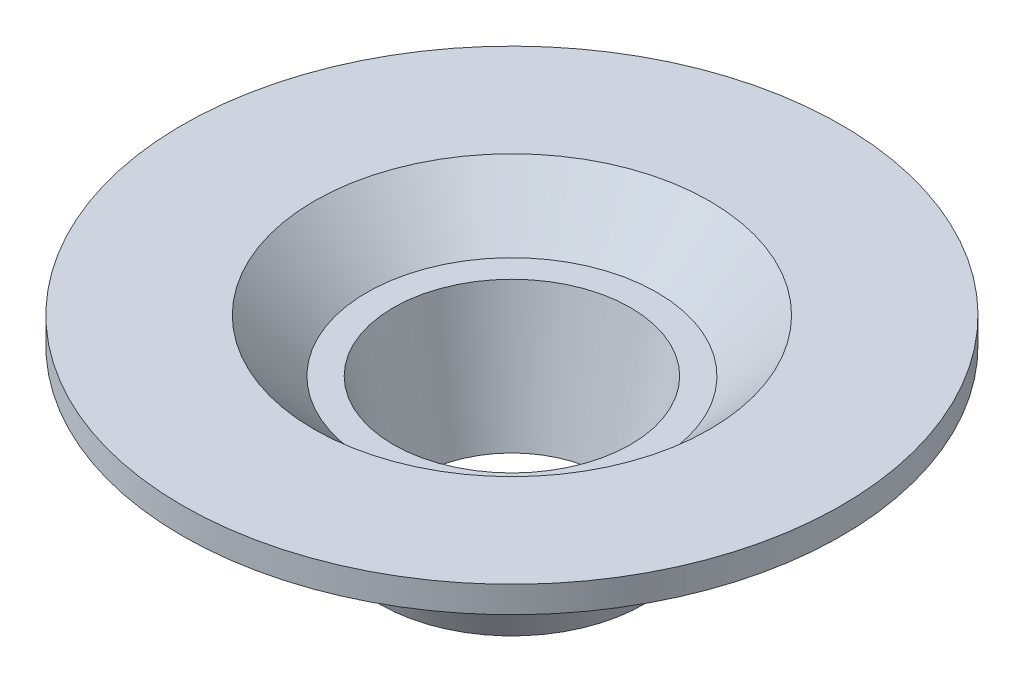
ISO-10303-21;
HEADER;
FILE_DESCRIPTION(('STEP AP214'),'2;1');
FILE_NAME('part.step','',(''),(''),'','','');
FILE_SCHEMA(('AUTOMOTIVE_DESIGN { 1 0 10303 214 1 1 1 1 }'));
ENDSEC;
DATA;
#1=APPLICATION_CONTEXT('core data for automotive mechanical design processes');
#2=APPLICATION_PROTOCOL_DEFINITION('international standard','automotive_design',2000,#1);
#3=PRODUCT_CONTEXT('',#1,'mechanical');
#4=PRODUCT('Part','Part','',(#3));
#5=PRODUCT_RELATED_PRODUCT_CATEGORY('part','',(#4));
#6=PRODUCT_DEFINITION_FORMATION('','',#4);
#7=PRODUCT_DEFINITION_CONTEXT('part definition',#1,'design');
#8=PRODUCT_DEFINITION('design','',#6,#7);
#9=PRODUCT_DEFINITION_SHAPE('','',#8);
#10=(LENGTH_UNIT() NAMED_UNIT(*) SI_UNIT(.MILLI.,.METRE.));
#11=(NAMED_UNIT(*) PLANE_ANGLE_UNIT() SI_UNIT($,.RADIAN.));
#12=(NAMED_UNIT(*) SI_UNIT($,.STERADIAN.) SOLID_ANGLE_UNIT());
#13=UNCERTAINTY_MEASURE_WITH_UNIT(LENGTH_MEASURE(1.E-05),#10,'distance_accuracy_value','');
#14=(GEOMETRIC_REPRESENTATION_CONTEXT(3) GLOBAL_UNCERTAINTY_ASSIGNED_CONTEXT((#13)) GLOBAL_UNIT_ASSIGNED_CONTEXT((#10,
#11,#12)) REPRESENTATION_CONTEXT('',''));
#15=CARTESIAN_POINT('',(0.,0.,0.));
#16=DIRECTION('',(0.,0.,1.));
#17=DIRECTION('',(1.,0.,0.));
#18=AXIS2_PLACEMENT_3D('',#15,#16,#17);
#19=CARTESIAN_POINT('',(0.,-5.,-5.));
#20=DIRECTION('',(0.,1.,0.));
#21=DIRECTION('',(0.,0.,1.));
#22=AXIS2_PLACEMENT_3D('',#19,#20,#21);
#23=PLANE('',#22);
#24=CARTESIAN_POINT('',(0.,-5.,0.));
#25=DIRECTION('',(0.,1.,0.));
#26=DIRECTION('',(0.,0.,1.));
#27=AXIS2_PLACEMENT_3D('',#24,#25,#26);
#28=CIRCLE('',#27,5.);
#29=CARTESIAN_POINT('',(0.,-5.,5.));
#30=VERTEX_POINT('',#29);
#31=EDGE_CURVE('E10',#30,#30,#28,.T.);
#32=ORIENTED_EDGE('',*,*,#31,.F.);
#33=EDGE_LOOP('',(#32));
#34=FACE_BOUND('',#33,.T.);
#35=CARTESIAN_POINT('',(0.,-5.,0.));
#36=DIRECTION('',(0.,1.,0.));
#37=DIRECTION('',(0.,0.,1.));
#38=AXIS2_PLACEMENT_3D('',#35,#36,#37);
#39=CIRCLE('',#38,3.5);
#40=CARTESIAN_POINT('',(0.,-5.,3.5));
#41=VERTEX_POINT('',#40);
#42=EDGE_CURVE('E71',#41,#41,#39,.T.);
#43=ORIENTED_EDGE('',*,*,#42,.T.);
#44=EDGE_LOOP('',(#43));
#45=FACE_BOUND('',#44,.T.);
#46=ADVANCED_FACE('F37',(#34,#45),#23,.F.);
#47=CARTESIAN_POINT('',(0.,-5.,0.));
#48=DIRECTION('',(0.,1.,0.));
#49=DIRECTION('',(0.,0.,1.));
#50=AXIS2_PLACEMENT_3D('',#47,#48,#49);
#51=CONICAL_SURFACE('',#50,5.,0.358770670270572);
#52=CARTESIAN_POINT('',(0.,-1.,0.));
#53=DIRECTION('',(0.,1.,0.));
#54=DIRECTION('',(0.,0.,1.));
#55=AXIS2_PLACEMENT_3D('',#52,#53,#54);
#56=CIRCLE('',#55,6.5);
#57=CARTESIAN_POINT('',(0.,-1.,6.5));
#58=VERTEX_POINT('',#57);
#59=EDGE_CURVE('E43',#58,#58,#56,.T.);
#60=ORIENTED_EDGE('',*,*,#59,.F.);
#61=EDGE_LOOP('',(#60));
#62=FACE_BOUND('',#61,.T.);
#63=ORIENTED_EDGE('',*,*,#31,.T.);
#64=EDGE_LOOP('',(#63));
#65=FACE_BOUND('',#64,.T.);
#66=ADVANCED_FACE('F120',(#62,#65),#51,.T.);
#67=CARTESIAN_POINT('',(0.,-1.,-8.5));
#68=DIRECTION('',(0.,1.,0.));
#69=DIRECTION('',(0.,0.,1.));
#70=AXIS2_PLACEMENT_3D('',#67,#68,#69);
#71=PLANE('',#70);
#72=CARTESIAN_POINT('',(0.,-1.,0.));
#73=DIRECTION('',(0.,1.,0.));
#74=DIRECTION('',(0.,0.,1.));
#75=AXIS2_PLACEMENT_3D('',#72,#73,#74);
#76=CIRCLE('',#75,8.5);
#77=CARTESIAN_POINT('',(0.,-1.,8.5));
#78=VERTEX_POINT('',#77);
#79=EDGE_CURVE('E47',#78,#78,#76,.T.);
#80=ORIENTED_EDGE('',*,*,#79,.F.);
#81=EDGE_LOOP('',(#80));
#82=FACE_BOUND('',#81,.T.);
#83=ORIENTED_EDGE('',*,*,#59,.T.);
#84=EDGE_LOOP('',(#83));
#85=FACE_BOUND('',#84,.T.);
#86=ADVANCED_FACE('F115',(#82,#85),#71,.F.);
#87=CARTESIAN_POINT('',(0.,-1.,0.));
#88=DIRECTION('',(0.,1.,0.));
#89=DIRECTION('',(0.,0.,1.));
#90=AXIS2_PLACEMENT_3D('',#87,#88,#89);
#91=CONICAL_SURFACE('',#90,8.5,0.785398163397448);
#92=CARTESIAN_POINT('',(0.,1.,0.));
#93=DIRECTION('',(0.,1.,0.));
#94=DIRECTION('',(0.,0.,1.));
#95=AXIS2_PLACEMENT_3D('',#92,#93,#94);
#96=CIRCLE('',#95,10.5);
#97=CARTESIAN_POINT('',(0.,1.,10.5));
#98=VERTEX_POINT('',#97);
#99=EDGE_CURVE('E51',#98,#98,#96,.T.);
#100=ORIENTED_EDGE('',*,*,#99,.F.);
#101=EDGE_LOOP('',(#100));
#102=FACE_BOUND('',#101,.T.);
#103=ORIENTED_EDGE('',*,*,#79,.T.);
#104=EDGE_LOOP('',(#103));
#105=FACE_BOUND('',#104,.T.);
#106=ADVANCED_FACE('F109',(#102,#105),#91,.T.);
#107=CARTESIAN_POINT('',(0.,1.,-12.5));
#108=DIRECTION('',(0.,1.,0.));
#109=DIRECTION('',(0.,0.,1.));
#110=AXIS2_PLACEMENT_3D('',#107,#108,#109);
#111=PLANE('',#110);
#112=CARTESIAN_POINT('',(0.,1.,0.));
#113=DIRECTION('',(0.,1.,0.));
#114=DIRECTION('',(0.,0.,1.));
#115=AXIS2_PLACEMENT_3D('',#112,#113,#114);
#116=CIRCLE('',#115,12.5);
#117=CARTESIAN_POINT('',(0.,1.,12.5));
#118=VERTEX_POINT('',#117);
#119=EDGE_CURVE('E56',#118,#118,#116,.T.);
#120=ORIENTED_EDGE('',*,*,#119,.F.);
#121=EDGE_LOOP('',(#120));
#122=FACE_BOUND('',#121,.T.);
#123=ORIENTED_EDGE('',*,*,#99,.T.);
#124=EDGE_LOOP('',(#123));
#125=FACE_BOUND('',#124,.T.);
#126=ADVANCED_FACE('F103',(#122,#125),#111,.F.);
#127=CARTESIAN_POINT('',(0.,0.,0.));
#128=DIRECTION('',(0.,1.,0.));
#129=DIRECTION('',(0.,0.,1.));
#130=AXIS2_PLACEMENT_3D('',#127,#128,#129);
#131=CYLINDRICAL_SURFACE('',#130,12.5);
#132=CARTESIAN_POINT('',(0.,2.,0.));
#133=DIRECTION('',(0.,1.,0.));
#134=DIRECTION('',(0.,0.,1.));
#135=AXIS2_PLACEMENT_3D('',#132,#133,#134);
#136=CIRCLE('',#135,12.5);
#137=CARTESIAN_POINT('',(0.,2.,12.5));
#138=VERTEX_POINT('',#137);
#139=EDGE_CURVE('E59',#138,#138,#136,.T.);
#140=ORIENTED_EDGE('',*,*,#139,.F.);
#141=EDGE_LOOP('',(#140));
#142=FACE_BOUND('',#141,.T.);
#143=ORIENTED_EDGE('',*,*,#119,.T.);
#144=EDGE_LOOP('',(#143));
#145=FACE_BOUND('',#144,.T.);
#146=ADVANCED_FACE('F97',(#142,#145),#131,.T.);
#147=CARTESIAN_POINT('',(0.,2.,-7.5));
#148=DIRECTION('',(0.,-1.,0.));
#149=DIRECTION('',(0.,0.,-1.));
#150=AXIS2_PLACEMENT_3D('',#147,#148,#149);
#151=PLANE('',#150);
#152=CARTESIAN_POINT('',(0.,2.,0.));
#153=DIRECTION('',(0.,1.,0.));
#154=DIRECTION('',(0.,0.,1.));
#155=AXIS2_PLACEMENT_3D('',#152,#153,#154);
#156=CIRCLE('',#155,7.5);
#157=CARTESIAN_POINT('',(0.,2.,7.5));
#158=VERTEX_POINT('',#157);
#159=EDGE_CURVE('E62',#158,#158,#156,.T.);
#160=ORIENTED_EDGE('',*,*,#159,.F.);
#161=EDGE_LOOP('',(#160));
#162=FACE_BOUND('',#161,.T.);
#163=ORIENTED_EDGE('',*,*,#139,.T.);
#164=EDGE_LOOP('',(#163));
#165=FACE_BOUND('',#164,.T.);
#166=ADVANCED_FACE('F91',(#162,#165),#151,.F.);
#167=CARTESIAN_POINT('',(0.,2.,0.));
#168=DIRECTION('',(0.,1.,0.));
#169=DIRECTION('',(0.,0.,1.));
#170=AXIS2_PLACEMENT_3D('',#167,#168,#169);
#171=CONICAL_SURFACE('',#170,7.5,0.785398163397448);
#172=CARTESIAN_POINT('',(0.,0.,0.));
#173=DIRECTION('',(0.,1.,0.));
#174=DIRECTION('',(0.,0.,1.));
#175=AXIS2_PLACEMENT_3D('',#172,#173,#174);
#176=CIRCLE('',#175,5.5);
#177=CARTESIAN_POINT('',(0.,0.,5.5));
#178=VERTEX_POINT('',#177);
#179=EDGE_CURVE('E65',#178,#178,#176,.T.);
#180=ORIENTED_EDGE('',*,*,#179,.F.);
#181=EDGE_LOOP('',(#180));
#182=FACE_BOUND('',#181,.T.);
#183=ORIENTED_EDGE('',*,*,#159,.T.);
#184=EDGE_LOOP('',(#183));
#185=FACE_BOUND('',#184,.T.);
#186=ADVANCED_FACE('F85',(#182,#185),#171,.F.);
#187=CARTESIAN_POINT('',(0.,0.,-4.5));
#188=DIRECTION('',(0.,-1.,0.));
#189=DIRECTION('',(0.,0.,-1.));
#190=AXIS2_PLACEMENT_3D('',#187,#188,#189);
#191=PLANE('',#190);
#192=CARTESIAN_POINT('',(0.,0.,0.));
#193=DIRECTION('',(0.,1.,0.));
#194=DIRECTION('',(0.,0.,1.));
#195=AXIS2_PLACEMENT_3D('',#192,#193,#194);
#196=CIRCLE('',#195,4.5);
#197=CARTESIAN_POINT('',(0.,0.,4.5));
#198=VERTEX_POINT('',#197);
#199=EDGE_CURVE('E68',#198,#198,#196,.T.);
#200=ORIENTED_EDGE('',*,*,#199,.F.);
#201=EDGE_LOOP('',(#200));
#202=FACE_BOUND('',#201,.T.);
#203=ORIENTED_EDGE('',*,*,#179,.T.);
#204=EDGE_LOOP('',(#203));
#205=FACE_BOUND('',#204,.T.);
#206=ADVANCED_FACE('F79',(#202,#205),#191,.F.);
#207=CARTESIAN_POINT('',(0.,0.,0.));
#208=DIRECTION('',(0.,1.,0.));
#209=DIRECTION('',(0.,0.,1.));
#210=AXIS2_PLACEMENT_3D('',#207,#208,#209);
#211=CONICAL_SURFACE('',#210,4.5,0.197395559849881);
#212=ORIENTED_EDGE('',*,*,#42,.F.);
#213=EDGE_LOOP('',(#212));
#214=FACE_BOUND('',#213,.T.);
#215=ORIENTED_EDGE('',*,*,#199,.T.);
#216=EDGE_LOOP('',(#215));
#217=FACE_BOUND('',#216,.T.);
#218=ADVANCED_FACE('F76',(#214,#217),#211,.F.);
#219=CLOSED_SHELL('',(#46,#66,#86,#106,#126,#146,#166,#186,#206,#218));
#220=MANIFOLD_SOLID_BREP('B2',#219);
#221=ADVANCED_BREP_SHAPE_REPRESENTATION('',(#18,#220),#14);
#222=SHAPE_DEFINITION_REPRESENTATION(#9,#221);
ENDSEC;
END-ISO-10303-21;
